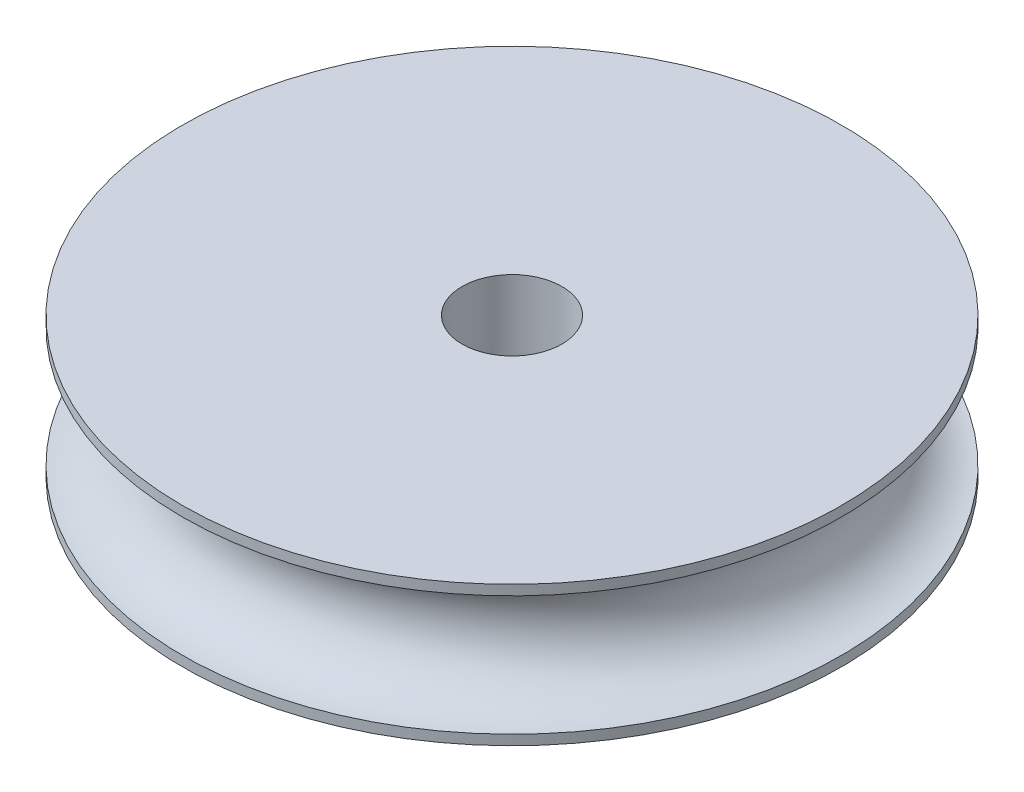
ISO-10303-21;
HEADER;
FILE_DESCRIPTION(('STEP AP214'),'2;1');
FILE_NAME('part.step','',(''),(''),'','','');
FILE_SCHEMA(('AUTOMOTIVE_DESIGN { 1 0 10303 214 1 1 1 1 }'));
ENDSEC;
DATA;
#1=APPLICATION_CONTEXT('core data for automotive mechanical design processes');
#2=APPLICATION_PROTOCOL_DEFINITION('international standard','automotive_design',2000,#1);
#3=PRODUCT_CONTEXT('',#1,'mechanical');
#4=PRODUCT('Part','Part','',(#3));
#5=PRODUCT_RELATED_PRODUCT_CATEGORY('part','',(#4));
#6=PRODUCT_DEFINITION_FORMATION('','',#4);
#7=PRODUCT_DEFINITION_CONTEXT('part definition',#1,'design');
#8=PRODUCT_DEFINITION('design','',#6,#7);
#9=PRODUCT_DEFINITION_SHAPE('','',#8);
#10=(LENGTH_UNIT() NAMED_UNIT(*) SI_UNIT(.MILLI.,.METRE.));
#11=(NAMED_UNIT(*) PLANE_ANGLE_UNIT() SI_UNIT($,.RADIAN.));
#12=(NAMED_UNIT(*) SI_UNIT($,.STERADIAN.) SOLID_ANGLE_UNIT());
#13=UNCERTAINTY_MEASURE_WITH_UNIT(LENGTH_MEASURE(1.E-05),#10,'distance_accuracy_value','');
#14=(GEOMETRIC_REPRESENTATION_CONTEXT(3) GLOBAL_UNCERTAINTY_ASSIGNED_CONTEXT((#13)) GLOBAL_UNIT_ASSIGNED_CONTEXT((#10,
#11,#12)) REPRESENTATION_CONTEXT('',''));
#15=CARTESIAN_POINT('',(0.,0.,0.));
#16=DIRECTION('',(0.,0.,1.));
#17=DIRECTION('',(1.,0.,0.));
#18=AXIS2_PLACEMENT_3D('',#15,#16,#17);
#19=CARTESIAN_POINT('',(0.,3.,0.));
#20=DIRECTION('',(0.,-1.,0.));
#21=DIRECTION('',(0.,0.,-1.));
#22=AXIS2_PLACEMENT_3D('',#19,#20,#21);
#23=TOROIDAL_SURFACE('',#22,16.5,3.);
#24=CARTESIAN_POINT('',(0.,0.,0.));
#25=DIRECTION('',(0.,-1.,0.));
#26=DIRECTION('',(0.,0.,-1.));
#27=AXIS2_PLACEMENT_3D('',#24,#25,#26);
#28=CIRCLE('',#27,16.5);
#29=CARTESIAN_POINT('',(0.,0.,-16.5));
#30=VERTEX_POINT('',#29);
#31=EDGE_CURVE('E10',#30,#30,#28,.T.);
#32=ORIENTED_EDGE('',*,*,#31,.F.);
#33=EDGE_LOOP('',(#32));
#34=FACE_BOUND('',#33,.T.);
#35=CARTESIAN_POINT('',(0.,6.,0.));
#36=DIRECTION('',(0.,1.,0.));
#37=DIRECTION('',(0.,0.,1.));
#38=AXIS2_PLACEMENT_3D('',#35,#36,#37);
#39=CIRCLE('',#38,16.5);
#40=CARTESIAN_POINT('',(0.,6.,16.5));
#41=VERTEX_POINT('',#40);
#42=EDGE_CURVE('E46',#41,#41,#39,.T.);
#43=ORIENTED_EDGE('',*,*,#42,.F.);
#44=EDGE_LOOP('',(#43));
#45=FACE_BOUND('',#44,.T.);
#46=ADVANCED_FACE('F35',(#34,#45),#23,.F.);
#47=CARTESIAN_POINT('',(0.,6.5,0.));
#48=DIRECTION('',(0.,-1.,0.));
#49=DIRECTION('',(0.,0.,-1.));
#50=AXIS2_PLACEMENT_3D('',#47,#48,#49);
#51=CYLINDRICAL_SURFACE('',#50,16.5);
#52=CARTESIAN_POINT('',(0.,6.5,0.));
#53=DIRECTION('',(0.,1.,0.));
#54=DIRECTION('',(0.,0.,1.));
#55=AXIS2_PLACEMENT_3D('',#52,#53,#54);
#56=CIRCLE('',#55,16.5);
#57=CARTESIAN_POINT('',(0.,6.5,16.5));
#58=VERTEX_POINT('',#57);
#59=EDGE_CURVE('E42',#58,#58,#56,.T.);
#60=ORIENTED_EDGE('',*,*,#59,.F.);
#61=EDGE_LOOP('',(#60));
#62=FACE_BOUND('',#61,.T.);
#63=ORIENTED_EDGE('',*,*,#42,.T.);
#64=EDGE_LOOP('',(#63));
#65=FACE_BOUND('',#64,.T.);
#66=ADVANCED_FACE('F78',(#62,#65),#51,.T.);
#67=CARTESIAN_POINT('',(0.,6.5,0.));
#68=DIRECTION('',(0.,1.,0.));
#69=DIRECTION('',(0.,0.,1.));
#70=AXIS2_PLACEMENT_3D('',#67,#68,#69);
#71=PLANE('',#70);
#72=CARTESIAN_POINT('',(0.,6.5,0.));
#73=DIRECTION('',(0.,1.,0.));
#74=DIRECTION('',(0.,0.,1.));
#75=AXIS2_PLACEMENT_3D('',#72,#73,#74);
#76=CIRCLE('',#75,2.5);
#77=CARTESIAN_POINT('',(0.,6.5,2.5));
#78=VERTEX_POINT('',#77);
#79=EDGE_CURVE('E54',#78,#78,#76,.T.);
#80=ORIENTED_EDGE('',*,*,#79,.F.);
#81=EDGE_LOOP('',(#80));
#82=FACE_BOUND('',#81,.T.);
#83=ORIENTED_EDGE('',*,*,#59,.T.);
#84=EDGE_LOOP('',(#83));
#85=FACE_BOUND('',#84,.T.);
#86=ADVANCED_FACE('F71',(#82,#85),#71,.T.);
#87=CARTESIAN_POINT('',(0.,-0.5,0.));
#88=DIRECTION('',(0.,1.,0.));
#89=DIRECTION('',(0.,0.,1.));
#90=AXIS2_PLACEMENT_3D('',#87,#88,#89);
#91=CYLINDRICAL_SURFACE('',#90,16.5);
#92=CARTESIAN_POINT('',(0.,-0.5,0.));
#93=DIRECTION('',(0.,-1.,0.));
#94=DIRECTION('',(0.,0.,-1.));
#95=AXIS2_PLACEMENT_3D('',#92,#93,#94);
#96=CIRCLE('',#95,16.5);
#97=CARTESIAN_POINT('',(0.,-0.5,-16.5));
#98=VERTEX_POINT('',#97);
#99=EDGE_CURVE('E50',#98,#98,#96,.T.);
#100=ORIENTED_EDGE('',*,*,#99,.F.);
#101=EDGE_LOOP('',(#100));
#102=FACE_BOUND('',#101,.T.);
#103=ORIENTED_EDGE('',*,*,#31,.T.);
#104=EDGE_LOOP('',(#103));
#105=FACE_BOUND('',#104,.T.);
#106=ADVANCED_FACE('F66',(#102,#105),#91,.T.);
#107=CARTESIAN_POINT('',(0.,-0.5,0.));
#108=DIRECTION('',(0.,-1.,0.));
#109=DIRECTION('',(0.,0.,-1.));
#110=AXIS2_PLACEMENT_3D('',#107,#108,#109);
#111=PLANE('',#110);
#112=CARTESIAN_POINT('',(0.,-0.5,0.));
#113=DIRECTION('',(0.,-1.,0.));
#114=DIRECTION('',(0.,0.,-1.));
#115=AXIS2_PLACEMENT_3D('',#112,#113,#114);
#116=CIRCLE('',#115,2.5);
#117=CARTESIAN_POINT('',(0.,-0.5,-2.5));
#118=VERTEX_POINT('',#117);
#119=EDGE_CURVE('E38',#118,#118,#116,.T.);
#120=ORIENTED_EDGE('',*,*,#119,.F.);
#121=EDGE_LOOP('',(#120));
#122=FACE_BOUND('',#121,.T.);
#123=ORIENTED_EDGE('',*,*,#99,.T.);
#124=EDGE_LOOP('',(#123));
#125=FACE_BOUND('',#124,.T.);
#126=ADVANCED_FACE('F63',(#122,#125),#111,.T.);
#127=CARTESIAN_POINT('',(0.,-3.5,0.));
#128=DIRECTION('',(0.,1.,0.));
#129=DIRECTION('',(0.,0.,1.));
#130=AXIS2_PLACEMENT_3D('',#127,#128,#129);
#131=CYLINDRICAL_SURFACE('',#130,2.5);
#132=ORIENTED_EDGE('',*,*,#119,.T.);
#133=EDGE_LOOP('',(#132));
#134=FACE_BOUND('',#133,.T.);
#135=ORIENTED_EDGE('',*,*,#79,.T.);
#136=EDGE_LOOP('',(#135));
#137=FACE_BOUND('',#136,.T.);
#138=ADVANCED_FACE('F61',(#134,#137),#131,.F.);
#139=CLOSED_SHELL('',(#46,#66,#86,#106,#126,#138));
#140=MANIFOLD_SOLID_BREP('B2',#139);
#141=ADVANCED_BREP_SHAPE_REPRESENTATION('',(#18,#140),#14);
#142=SHAPE_DEFINITION_REPRESENTATION(#9,#141);
ENDSEC;
END-ISO-10303-21;
